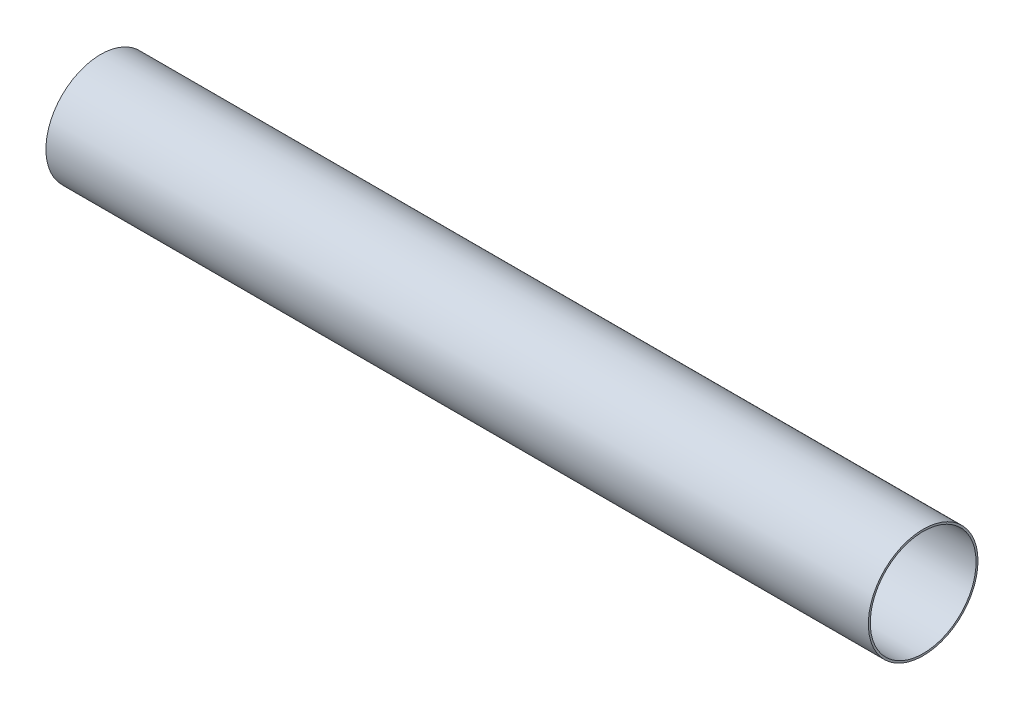
ISO-10303-21;
HEADER;
FILE_DESCRIPTION(('STEP AP214'),'2;1');
FILE_NAME('part.step','',(''),(''),'','','');
FILE_SCHEMA(('AUTOMOTIVE_DESIGN { 1 0 10303 214 1 1 1 1 }'));
ENDSEC;
DATA;
#1=APPLICATION_CONTEXT('core data for automotive mechanical design processes');
#2=APPLICATION_PROTOCOL_DEFINITION('international standard','automotive_design',2000,#1);
#3=PRODUCT_CONTEXT('',#1,'mechanical');
#4=PRODUCT('Part','Part','',(#3));
#5=PRODUCT_RELATED_PRODUCT_CATEGORY('part','',(#4));
#6=PRODUCT_DEFINITION_FORMATION('','',#4);
#7=PRODUCT_DEFINITION_CONTEXT('part definition',#1,'design');
#8=PRODUCT_DEFINITION('design','',#6,#7);
#9=PRODUCT_DEFINITION_SHAPE('','',#8);
#10=(LENGTH_UNIT() NAMED_UNIT(*) SI_UNIT(.MILLI.,.METRE.));
#11=(NAMED_UNIT(*) PLANE_ANGLE_UNIT() SI_UNIT($,.RADIAN.));
#12=(NAMED_UNIT(*) SI_UNIT($,.STERADIAN.) SOLID_ANGLE_UNIT());
#13=UNCERTAINTY_MEASURE_WITH_UNIT(LENGTH_MEASURE(1.E-05),#10,'distance_accuracy_value','');
#14=(GEOMETRIC_REPRESENTATION_CONTEXT(3) GLOBAL_UNCERTAINTY_ASSIGNED_CONTEXT((#13)) GLOBAL_UNIT_ASSIGNED_CONTEXT((#10,
#11,#12)) REPRESENTATION_CONTEXT('',''));
#15=CARTESIAN_POINT('',(0.,0.,0.));
#16=DIRECTION('',(0.,0.,1.));
#17=DIRECTION('',(1.,0.,0.));
#18=AXIS2_PLACEMENT_3D('',#15,#16,#17);
#19=CARTESIAN_POINT('',(762.,0.,0.));
#20=DIRECTION('',(1.,0.,0.));
#21=DIRECTION('',(0.,0.,-1.));
#22=AXIS2_PLACEMENT_3D('',#19,#20,#21);
#23=PLANE('',#22);
#24=CARTESIAN_POINT('',(762.,0.,0.));
#25=DIRECTION('',(1.,0.,0.));
#26=DIRECTION('',(0.,0.,-1.));
#27=AXIS2_PLACEMENT_3D('',#24,#25,#26);
#28=CIRCLE('',#27,50.8);
#29=CARTESIAN_POINT('',(762.,0.,-50.8));
#30=VERTEX_POINT('',#29);
#31=EDGE_CURVE('E10',#30,#30,#28,.T.);
#32=ORIENTED_EDGE('',*,*,#31,.T.);
#33=EDGE_LOOP('',(#32));
#34=FACE_BOUND('',#33,.T.);
#35=CARTESIAN_POINT('',(762.,0.,0.));
#36=DIRECTION('',(1.,0.,0.));
#37=DIRECTION('',(0.,0.,-1.));
#38=AXIS2_PLACEMENT_3D('',#35,#36,#37);
#39=CIRCLE('',#38,49.022);
#40=CARTESIAN_POINT('',(762.,0.,-49.022));
#41=VERTEX_POINT('',#40);
#42=EDGE_CURVE('E50',#41,#41,#39,.T.);
#43=ORIENTED_EDGE('',*,*,#42,.F.);
#44=EDGE_LOOP('',(#43));
#45=FACE_BOUND('',#44,.T.);
#46=ADVANCED_FACE('F37',(#34,#45),#23,.T.);
#47=CARTESIAN_POINT('',(0.,0.,0.));
#48=DIRECTION('',(1.,0.,0.));
#49=DIRECTION('',(0.,0.,-1.));
#50=AXIS2_PLACEMENT_3D('',#47,#48,#49);
#51=PLANE('',#50);
#52=CARTESIAN_POINT('',(0.,0.,0.));
#53=DIRECTION('',(1.,0.,0.));
#54=DIRECTION('',(0.,0.,-1.));
#55=AXIS2_PLACEMENT_3D('',#52,#53,#54);
#56=CIRCLE('',#55,50.8);
#57=CARTESIAN_POINT('',(0.,0.,-50.8));
#58=VERTEX_POINT('',#57);
#59=EDGE_CURVE('E41',#58,#58,#56,.T.);
#60=ORIENTED_EDGE('',*,*,#59,.F.);
#61=EDGE_LOOP('',(#60));
#62=FACE_BOUND('',#61,.T.);
#63=CARTESIAN_POINT('',(0.,0.,0.));
#64=DIRECTION('',(1.,0.,0.));
#65=DIRECTION('',(0.,0.,-1.));
#66=AXIS2_PLACEMENT_3D('',#63,#64,#65);
#67=CIRCLE('',#66,49.022);
#68=CARTESIAN_POINT('',(0.,0.,-49.022));
#69=VERTEX_POINT('',#68);
#70=EDGE_CURVE('E52',#69,#69,#67,.T.);
#71=ORIENTED_EDGE('',*,*,#70,.T.);
#72=EDGE_LOOP('',(#71));
#73=FACE_BOUND('',#72,.T.);
#74=ADVANCED_FACE('F64',(#62,#73),#51,.F.);
#75=CARTESIAN_POINT('',(762.,0.,0.));
#76=DIRECTION('',(-1.,0.,0.));
#77=DIRECTION('',(0.,0.,1.));
#78=AXIS2_PLACEMENT_3D('',#75,#76,#77);
#79=CYLINDRICAL_SURFACE('',#78,50.8);
#80=ORIENTED_EDGE('',*,*,#31,.F.);
#81=EDGE_LOOP('',(#80));
#82=FACE_BOUND('',#81,.T.);
#83=ORIENTED_EDGE('',*,*,#59,.T.);
#84=EDGE_LOOP('',(#83));
#85=FACE_BOUND('',#84,.T.);
#86=ADVANCED_FACE('F39',(#82,#85),#79,.T.);
#87=CARTESIAN_POINT('',(762.,0.,0.));
#88=DIRECTION('',(-1.,0.,0.));
#89=DIRECTION('',(0.,0.,1.));
#90=AXIS2_PLACEMENT_3D('',#87,#88,#89);
#91=CYLINDRICAL_SURFACE('',#90,49.022);
#92=ORIENTED_EDGE('',*,*,#42,.T.);
#93=EDGE_LOOP('',(#92));
#94=FACE_BOUND('',#93,.T.);
#95=ORIENTED_EDGE('',*,*,#70,.F.);
#96=EDGE_LOOP('',(#95));
#97=FACE_BOUND('',#96,.T.);
#98=ADVANCED_FACE('F60',(#94,#97),#91,.F.);
#99=CLOSED_SHELL('',(#46,#74,#86,#98));
#100=MANIFOLD_SOLID_BREP('B2',#99);
#101=ADVANCED_BREP_SHAPE_REPRESENTATION('',(#18,#100),#14);
#102=SHAPE_DEFINITION_REPRESENTATION(#9,#101);
ENDSEC;
END-ISO-10303-21;
